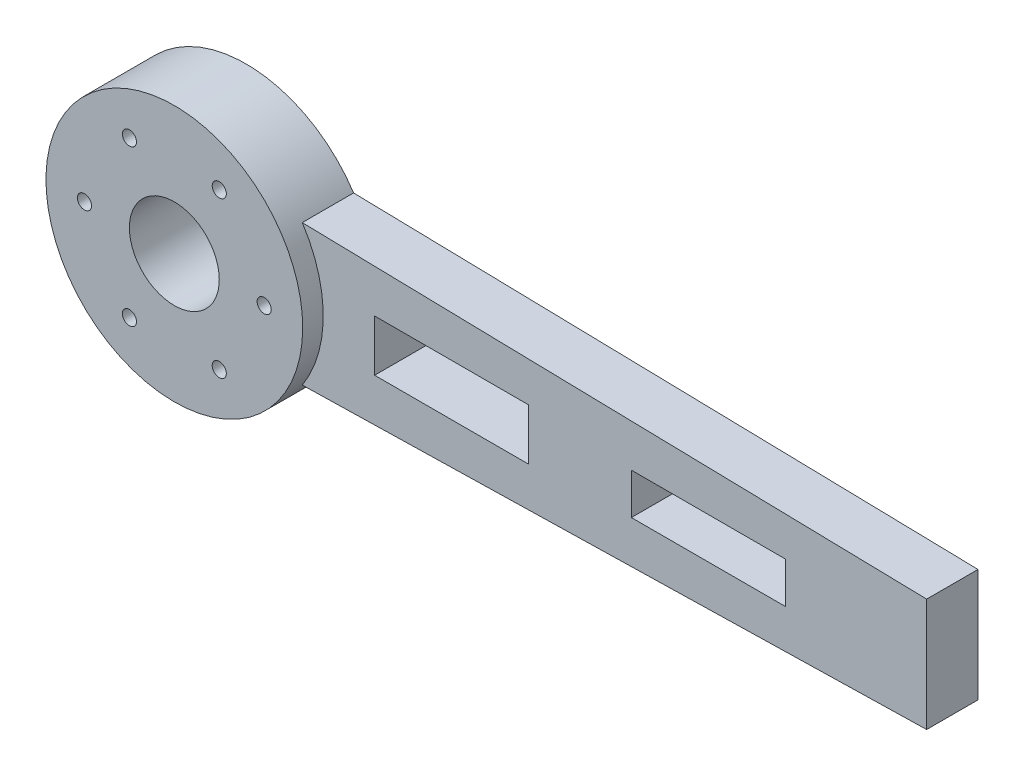
ISO-10303-21;
HEADER;
FILE_DESCRIPTION(('STEP AP214'),'2;1');
FILE_NAME('part.step','',(''),(''),'','','');
FILE_SCHEMA(('AUTOMOTIVE_DESIGN { 1 0 10303 214 1 1 1 1 }'));
ENDSEC;
DATA;
#1=APPLICATION_CONTEXT('core data for automotive mechanical design processes');
#2=APPLICATION_PROTOCOL_DEFINITION('international standard','automotive_design',2000,#1);
#3=PRODUCT_CONTEXT('',#1,'mechanical');
#4=PRODUCT('Part','Part','',(#3));
#5=PRODUCT_RELATED_PRODUCT_CATEGORY('part','',(#4));
#6=PRODUCT_DEFINITION_FORMATION('','',#4);
#7=PRODUCT_DEFINITION_CONTEXT('part definition',#1,'design');
#8=PRODUCT_DEFINITION('design','',#6,#7);
#9=PRODUCT_DEFINITION_SHAPE('','',#8);
#10=(LENGTH_UNIT() NAMED_UNIT(*) SI_UNIT(.MILLI.,.METRE.));
#11=(NAMED_UNIT(*) PLANE_ANGLE_UNIT() SI_UNIT($,.RADIAN.));
#12=(NAMED_UNIT(*) SI_UNIT($,.STERADIAN.) SOLID_ANGLE_UNIT());
#13=UNCERTAINTY_MEASURE_WITH_UNIT(LENGTH_MEASURE(1.E-05),#10,'distance_accuracy_value','');
#14=(GEOMETRIC_REPRESENTATION_CONTEXT(3) GLOBAL_UNCERTAINTY_ASSIGNED_CONTEXT((#13)) GLOBAL_UNIT_ASSIGNED_CONTEXT((#10,
#11,#12)) REPRESENTATION_CONTEXT('',''));
#15=CARTESIAN_POINT('',(0.,0.,0.));
#16=DIRECTION('',(0.,0.,1.));
#17=DIRECTION('',(1.,0.,0.));
#18=AXIS2_PLACEMENT_3D('',#15,#16,#17);
#19=CARTESIAN_POINT('',(0.,0.,28.));
#20=DIRECTION('',(0.,0.,-1.));
#21=DIRECTION('',(-1.,0.,0.));
#22=AXIS2_PLACEMENT_3D('',#19,#20,#21);
#23=CYLINDRICAL_SURFACE('',#22,50.);
#24=CARTESIAN_POINT('',(0.,0.,28.));
#25=DIRECTION('',(0.,0.,1.));
#26=DIRECTION('',(1.,0.,0.));
#27=AXIS2_PLACEMENT_3D('',#24,#25,#26);
#28=CIRCLE('',#27,50.);
#29=CARTESIAN_POINT('',(50.,0.,28.));
#30=VERTEX_POINT('',#29);
#31=EDGE_CURVE('E311',#30,#30,#28,.T.);
#32=ORIENTED_EDGE('',*,*,#31,.F.);
#33=EDGE_LOOP('',(#32));
#34=FACE_BOUND('',#33,.T.);
#35=DIRECTION('',(0.,0.,-1.));
#36=VECTOR('',#35,1.);
#37=CARTESIAN_POINT('',(41.8213149670181,-27.4039707785107,28.));
#38=LINE('',#37,#36);
#39=CARTESIAN_POINT('',(41.8213149670181,-27.4039707785107,20.));
#40=VERTEX_POINT('',#39);
#41=CARTESIAN_POINT('',(41.8213149670181,-27.4039707785107,0.));
#42=VERTEX_POINT('',#41);
#43=EDGE_CURVE('E47',#40,#42,#38,.T.);
#44=ORIENTED_EDGE('',*,*,#43,.F.);
#45=CARTESIAN_POINT('',(0.,0.,20.));
#46=DIRECTION('',(0.,0.,-1.));
#47=DIRECTION('',(-1.,0.,0.));
#48=AXIS2_PLACEMENT_3D('',#45,#46,#47);
#49=CIRCLE('',#48,50.);
#50=CARTESIAN_POINT('',(41.8213149670181,27.4039707785107,20.));
#51=VERTEX_POINT('',#50);
#52=EDGE_CURVE('E267',#51,#40,#49,.T.);
#53=ORIENTED_EDGE('',*,*,#52,.F.);
#54=DIRECTION('',(0.,0.,-1.));
#55=VECTOR('',#54,1.);
#56=CARTESIAN_POINT('',(41.8213149670181,27.4039707785107,28.));
#57=LINE('',#56,#55);
#58=CARTESIAN_POINT('',(41.8213149670181,27.4039707785107,0.));
#59=VERTEX_POINT('',#58);
#60=EDGE_CURVE('E269',#59,#51,#57,.F.);
#61=ORIENTED_EDGE('',*,*,#60,.F.);
#62=CARTESIAN_POINT('',(0.,0.,0.));
#63=DIRECTION('',(0.,0.,1.));
#64=DIRECTION('',(1.,0.,0.));
#65=AXIS2_PLACEMENT_3D('',#62,#63,#64);
#66=CIRCLE('',#65,50.);
#67=EDGE_CURVE('E52',#59,#42,#66,.T.);
#68=ORIENTED_EDGE('',*,*,#67,.T.);
#69=EDGE_LOOP('',(#44,#53,#61,#68));
#70=FACE_BOUND('',#69,.T.);
#71=ADVANCED_FACE('F33',(#34,#70),#23,.T.);
#72=CARTESIAN_POINT('',(0.,0.,28.));
#73=DIRECTION('',(0.,0.,-1.));
#74=DIRECTION('',(-1.,0.,0.));
#75=AXIS2_PLACEMENT_3D('',#72,#73,#74);
#76=CYLINDRICAL_SURFACE('',#75,17.5);
#77=CARTESIAN_POINT('',(0.,0.,28.));
#78=DIRECTION('',(0.,0.,1.));
#79=DIRECTION('',(1.,0.,0.));
#80=AXIS2_PLACEMENT_3D('',#77,#78,#79);
#81=CIRCLE('',#80,17.5);
#82=CARTESIAN_POINT('',(17.5,0.,28.));
#83=VERTEX_POINT('',#82);
#84=EDGE_CURVE('E306',#83,#83,#81,.T.);
#85=ORIENTED_EDGE('',*,*,#84,.T.);
#86=EDGE_LOOP('',(#85));
#87=FACE_BOUND('',#86,.T.);
#88=CARTESIAN_POINT('',(0.,0.,20.));
#89=DIRECTION('',(0.,0.,-1.));
#90=DIRECTION('',(-1.,0.,0.));
#91=AXIS2_PLACEMENT_3D('',#88,#89,#90);
#92=CIRCLE('',#91,17.5);
#93=CARTESIAN_POINT('',(15.,9.01387818865998,20.));
#94=VERTEX_POINT('',#93);
#95=CARTESIAN_POINT('',(15.,-9.01387818865998,20.));
#96=VERTEX_POINT('',#95);
#97=EDGE_CURVE('E264',#94,#96,#92,.T.);
#98=ORIENTED_EDGE('',*,*,#97,.T.);
#99=DIRECTION('',(0.,0.,-1.));
#100=VECTOR('',#99,1.);
#101=CARTESIAN_POINT('',(15.,-9.01387818865998,28.));
#102=LINE('',#101,#100);
#103=CARTESIAN_POINT('',(15.,-9.01387818865998,0.));
#104=VERTEX_POINT('',#103);
#105=EDGE_CURVE('E11',#96,#104,#102,.T.);
#106=ORIENTED_EDGE('',*,*,#105,.T.);
#107=CARTESIAN_POINT('',(0.,0.,0.));
#108=DIRECTION('',(0.,0.,1.));
#109=DIRECTION('',(1.,0.,0.));
#110=AXIS2_PLACEMENT_3D('',#107,#108,#109);
#111=CIRCLE('',#110,17.5);
#112=CARTESIAN_POINT('',(15.,9.01387818865998,0.));
#113=VERTEX_POINT('',#112);
#114=EDGE_CURVE('E305',#113,#104,#111,.T.);
#115=ORIENTED_EDGE('',*,*,#114,.F.);
#116=DIRECTION('',(0.,0.,-1.));
#117=VECTOR('',#116,1.);
#118=CARTESIAN_POINT('',(15.,9.01387818865998,28.));
#119=LINE('',#118,#117);
#120=EDGE_CURVE('E40',#113,#94,#119,.F.);
#121=ORIENTED_EDGE('',*,*,#120,.T.);
#122=EDGE_LOOP('',(#98,#106,#115,#121));
#123=FACE_BOUND('',#122,.T.);
#124=ADVANCED_FACE('F332',(#87,#123),#76,.F.);
#125=CARTESIAN_POINT('',(35.,0.,28.));
#126=DIRECTION('',(0.,0.,-1.));
#127=DIRECTION('',(-1.,0.,0.));
#128=AXIS2_PLACEMENT_3D('',#125,#126,#127);
#129=CYLINDRICAL_SURFACE('',#128,2.75);
#130=CARTESIAN_POINT('',(35.,0.,28.));
#131=DIRECTION('',(0.,0.,1.));
#132=DIRECTION('',(1.,0.,0.));
#133=AXIS2_PLACEMENT_3D('',#130,#131,#132);
#134=CIRCLE('',#133,2.75);
#135=CARTESIAN_POINT('',(37.75,0.,28.));
#136=VERTEX_POINT('',#135);
#137=EDGE_CURVE('E300',#136,#136,#134,.T.);
#138=ORIENTED_EDGE('',*,*,#137,.T.);
#139=EDGE_LOOP('',(#138));
#140=FACE_BOUND('',#139,.T.);
#141=CARTESIAN_POINT('',(35.,0.,20.));
#142=DIRECTION('',(0.,0.,-1.));
#143=DIRECTION('',(-1.,0.,0.));
#144=AXIS2_PLACEMENT_3D('',#141,#142,#143);
#145=CIRCLE('',#144,2.75);
#146=CARTESIAN_POINT('',(32.25,0.,20.));
#147=VERTEX_POINT('',#146);
#148=EDGE_CURVE('E261',#147,#147,#145,.T.);
#149=ORIENTED_EDGE('',*,*,#148,.T.);
#150=EDGE_LOOP('',(#149));
#151=FACE_BOUND('',#150,.T.);
#152=ADVANCED_FACE('F370',(#140,#151),#129,.F.);
#153=CARTESIAN_POINT('',(17.5,30.3108891324554,28.));
#154=DIRECTION('',(0.,0.,-1.));
#155=DIRECTION('',(-1.,0.,0.));
#156=AXIS2_PLACEMENT_3D('',#153,#154,#155);
#157=CYLINDRICAL_SURFACE('',#156,2.75);
#158=CARTESIAN_POINT('',(17.5,30.3108891324554,28.));
#159=DIRECTION('',(0.,0.,1.));
#160=DIRECTION('',(1.,0.,0.));
#161=AXIS2_PLACEMENT_3D('',#158,#159,#160);
#162=CIRCLE('',#161,2.75);
#163=CARTESIAN_POINT('',(20.25,30.3108891324554,28.));
#164=VERTEX_POINT('',#163);
#165=EDGE_CURVE('E297',#164,#164,#162,.T.);
#166=ORIENTED_EDGE('',*,*,#165,.T.);
#167=EDGE_LOOP('',(#166));
#168=FACE_BOUND('',#167,.T.);
#169=CARTESIAN_POINT('',(17.5,30.3108891324554,20.));
#170=DIRECTION('',(0.,0.,-1.));
#171=DIRECTION('',(-1.,0.,0.));
#172=AXIS2_PLACEMENT_3D('',#169,#170,#171);
#173=CIRCLE('',#172,2.75);
#174=CARTESIAN_POINT('',(18.8489494966299,27.9144677889638,20.));
#175=VERTEX_POINT('',#174);
#176=CARTESIAN_POINT('',(16.0459270966964,27.976757175629,20.));
#177=VERTEX_POINT('',#176);
#178=EDGE_CURVE('E258',#175,#177,#173,.T.);
#179=ORIENTED_EDGE('',*,*,#178,.T.);
#180=DIRECTION('',(0.,0.,-1.));
#181=VECTOR('',#180,1.);
#182=CARTESIAN_POINT('',(16.0459270966964,27.976757175629,28.));
#183=LINE('',#182,#181);
#184=CARTESIAN_POINT('',(16.0459270966964,27.976757175629,0.));
#185=VERTEX_POINT('',#184);
#186=EDGE_CURVE('E327',#177,#185,#183,.T.);
#187=ORIENTED_EDGE('',*,*,#186,.T.);
#188=CARTESIAN_POINT('',(17.5,30.3108891324554,0.));
#189=DIRECTION('',(0.,0.,1.));
#190=DIRECTION('',(1.,0.,0.));
#191=AXIS2_PLACEMENT_3D('',#188,#189,#190);
#192=CIRCLE('',#191,2.75);
#193=CARTESIAN_POINT('',(18.8489494966299,27.9144677889638,0.));
#194=VERTEX_POINT('',#193);
#195=EDGE_CURVE('E294',#194,#185,#192,.T.);
#196=ORIENTED_EDGE('',*,*,#195,.F.);
#197=DIRECTION('',(0.,0.,-1.));
#198=VECTOR('',#197,1.);
#199=CARTESIAN_POINT('',(18.8489494966299,27.9144677889638,28.));
#200=LINE('',#199,#198);
#201=EDGE_CURVE('E324',#194,#175,#200,.F.);
#202=ORIENTED_EDGE('',*,*,#201,.T.);
#203=EDGE_LOOP('',(#179,#187,#196,#202));
#204=FACE_BOUND('',#203,.T.);
#205=ADVANCED_FACE('F390',(#168,#204),#157,.F.);
#206=CARTESIAN_POINT('',(17.5,-30.3108891324554,28.));
#207=DIRECTION('',(0.,0.,-1.));
#208=DIRECTION('',(-1.,0.,0.));
#209=AXIS2_PLACEMENT_3D('',#206,#207,#208);
#210=CYLINDRICAL_SURFACE('',#209,2.74999999999997);
#211=CARTESIAN_POINT('',(17.5,-30.3108891324554,28.));
#212=DIRECTION('',(0.,0.,1.));
#213=DIRECTION('',(1.,0.,0.));
#214=AXIS2_PLACEMENT_3D('',#211,#212,#213);
#215=CIRCLE('',#214,2.74999999999997);
#216=CARTESIAN_POINT('',(20.25,-30.3108891324554,28.));
#217=VERTEX_POINT('',#216);
#218=EDGE_CURVE('E273',#217,#217,#215,.T.);
#219=ORIENTED_EDGE('',*,*,#218,.T.);
#220=EDGE_LOOP('',(#219));
#221=FACE_BOUND('',#220,.T.);
#222=CARTESIAN_POINT('',(17.5,-30.3108891324554,20.));
#223=DIRECTION('',(0.,0.,-1.));
#224=DIRECTION('',(-1.,0.,0.));
#225=AXIS2_PLACEMENT_3D('',#222,#223,#224);
#226=CIRCLE('',#225,2.74999999999997);
#227=CARTESIAN_POINT('',(16.0459270966964,-27.976757175629,20.));
#228=VERTEX_POINT('',#227);
#229=CARTESIAN_POINT('',(18.8489494966297,-27.9144677889638,20.));
#230=VERTEX_POINT('',#229);
#231=EDGE_CURVE('E318',#228,#230,#226,.T.);
#232=ORIENTED_EDGE('',*,*,#231,.T.);
#233=DIRECTION('',(0.,0.,-1.));
#234=VECTOR('',#233,1.);
#235=CARTESIAN_POINT('',(18.8489494966299,-27.9144677889638,28.));
#236=LINE('',#235,#234);
#237=CARTESIAN_POINT('',(18.8489494966297,-27.9144677889638,0.));
#238=VERTEX_POINT('',#237);
#239=EDGE_CURVE('E321',#230,#238,#236,.T.);
#240=ORIENTED_EDGE('',*,*,#239,.T.);
#241=CARTESIAN_POINT('',(17.5,-30.3108891324554,0.));
#242=DIRECTION('',(0.,0.,1.));
#243=DIRECTION('',(1.,0.,0.));
#244=AXIS2_PLACEMENT_3D('',#241,#242,#243);
#245=CIRCLE('',#244,2.74999999999997);
#246=CARTESIAN_POINT('',(16.0459270966963,-27.976757175629,0.));
#247=VERTEX_POINT('',#246);
#248=EDGE_CURVE('E272',#247,#238,#245,.T.);
#249=ORIENTED_EDGE('',*,*,#248,.F.);
#250=DIRECTION('',(0.,0.,-1.));
#251=VECTOR('',#250,1.);
#252=CARTESIAN_POINT('',(16.0459270966964,-27.976757175629,28.));
#253=LINE('',#252,#251);
#254=EDGE_CURVE('E314',#247,#228,#253,.F.);
#255=ORIENTED_EDGE('',*,*,#254,.T.);
#256=EDGE_LOOP('',(#232,#240,#249,#255));
#257=FACE_BOUND('',#256,.T.);
#258=ADVANCED_FACE('F377',(#221,#257),#210,.F.);
#259=CARTESIAN_POINT('',(0.,0.,28.));
#260=DIRECTION('',(0.,0.,1.));
#261=DIRECTION('',(1.,0.,0.));
#262=AXIS2_PLACEMENT_3D('',#259,#260,#261);
#263=PLANE('',#262);
#264=CARTESIAN_POINT('',(-17.5,-30.3108891324554,28.));
#265=DIRECTION('',(0.,0.,1.));
#266=DIRECTION('',(1.,0.,0.));
#267=AXIS2_PLACEMENT_3D('',#264,#265,#266);
#268=CIRCLE('',#267,2.74999999999998);
#269=CARTESIAN_POINT('',(-14.75,-30.3108891324554,28.));
#270=VERTEX_POINT('',#269);
#271=EDGE_CURVE('E279',#270,#270,#268,.T.);
#272=ORIENTED_EDGE('',*,*,#271,.F.);
#273=EDGE_LOOP('',(#272));
#274=FACE_BOUND('',#273,.T.);
#275=CARTESIAN_POINT('',(-17.5,30.3108891324554,28.));
#276=DIRECTION('',(0.,0.,1.));
#277=DIRECTION('',(1.,0.,0.));
#278=AXIS2_PLACEMENT_3D('',#275,#276,#277);
#279=CIRCLE('',#278,2.75);
#280=CARTESIAN_POINT('',(-14.75,30.3108891324554,28.));
#281=VERTEX_POINT('',#280);
#282=EDGE_CURVE('E291',#281,#281,#279,.T.);
#283=ORIENTED_EDGE('',*,*,#282,.F.);
#284=EDGE_LOOP('',(#283));
#285=FACE_BOUND('',#284,.T.);
#286=ORIENTED_EDGE('',*,*,#137,.F.);
#287=EDGE_LOOP('',(#286));
#288=FACE_BOUND('',#287,.T.);
#289=ORIENTED_EDGE('',*,*,#31,.T.);
#290=EDGE_LOOP('',(#289));
#291=FACE_BOUND('',#290,.T.);
#292=ORIENTED_EDGE('',*,*,#84,.F.);
#293=EDGE_LOOP('',(#292));
#294=FACE_BOUND('',#293,.T.);
#295=ORIENTED_EDGE('',*,*,#165,.F.);
#296=EDGE_LOOP('',(#295));
#297=FACE_BOUND('',#296,.T.);
#298=CARTESIAN_POINT('',(-35.,0.,28.));
#299=DIRECTION('',(0.,0.,1.));
#300=DIRECTION('',(1.,0.,0.));
#301=AXIS2_PLACEMENT_3D('',#298,#299,#300);
#302=CIRCLE('',#301,2.75);
#303=CARTESIAN_POINT('',(-32.25,0.,28.));
#304=VERTEX_POINT('',#303);
#305=EDGE_CURVE('E285',#304,#304,#302,.T.);
#306=ORIENTED_EDGE('',*,*,#305,.F.);
#307=EDGE_LOOP('',(#306));
#308=FACE_BOUND('',#307,.T.);
#309=ORIENTED_EDGE('',*,*,#218,.F.);
#310=EDGE_LOOP('',(#309));
#311=FACE_BOUND('',#310,.T.);
#312=ADVANCED_FACE('F342',(#274,#285,#288,#291,#294,#297,#308,#311),#263,.T.);
#313=CARTESIAN_POINT('',(0.,0.,0.));
#314=DIRECTION('',(0.,0.,1.));
#315=DIRECTION('',(1.,0.,0.));
#316=AXIS2_PLACEMENT_3D('',#313,#314,#315);
#317=PLANE('',#316);
#318=ORIENTED_EDGE('',*,*,#248,.T.);
#319=DIRECTION('',(0.99975317783161,0.0222167372851469,0.));
#320=VECTOR('',#319,1.);
#321=CARTESIAN_POINT('',(285.,-22.,0.));
#322=LINE('',#321,#320);
#323=EDGE_CURVE('E244',#247,#238,#322,.T.);
#324=ORIENTED_EDGE('',*,*,#323,.F.);
#325=EDGE_LOOP('',(#318,#324));
#326=FACE_BOUND('',#325,.T.);
#327=ORIENTED_EDGE('',*,*,#195,.T.);
#328=DIRECTION('',(-0.99975317783161,0.0222167372851469,0.));
#329=VECTOR('',#328,1.);
#330=CARTESIAN_POINT('',(15.,28.,0.));
#331=LINE('',#330,#329);
#332=EDGE_CURVE('E247',#194,#185,#331,.T.);
#333=ORIENTED_EDGE('',*,*,#332,.F.);
#334=EDGE_LOOP('',(#327,#333));
#335=FACE_BOUND('',#334,.T.);
#336=ORIENTED_EDGE('',*,*,#67,.F.);
#337=CARTESIAN_POINT('',(285.,22.,0.));
#338=VERTEX_POINT('',#337);
#339=EDGE_CURVE('E248',#338,#59,#331,.T.);
#340=ORIENTED_EDGE('',*,*,#339,.F.);
#341=DIRECTION('',(0.,1.,0.));
#342=VECTOR('',#341,1.);
#343=CARTESIAN_POINT('',(285.,22.,0.));
#344=LINE('',#343,#342);
#345=CARTESIAN_POINT('',(285.,-22.,0.));
#346=VERTEX_POINT('',#345);
#347=EDGE_CURVE('E245',#346,#338,#344,.T.);
#348=ORIENTED_EDGE('',*,*,#347,.F.);
#349=EDGE_CURVE('E228',#42,#346,#322,.T.);
#350=ORIENTED_EDGE('',*,*,#349,.F.);
#351=EDGE_LOOP('',(#336,#340,#348,#350));
#352=FACE_BOUND('',#351,.T.);
#353=ORIENTED_EDGE('',*,*,#114,.T.);
#354=DIRECTION('',(0.,-1.,0.));
#355=VECTOR('',#354,1.);
#356=CARTESIAN_POINT('',(15.,-28.,0.));
#357=LINE('',#356,#355);
#358=EDGE_CURVE('E232',#113,#104,#357,.T.);
#359=ORIENTED_EDGE('',*,*,#358,.F.);
#360=EDGE_LOOP('',(#353,#359));
#361=FACE_BOUND('',#360,.T.);
#362=DIRECTION('',(1.,0.,0.));
#363=VECTOR('',#362,1.);
#364=CARTESIAN_POINT('',(70.,-10.,0.));
#365=LINE('',#364,#363);
#366=CARTESIAN_POINT('',(70.,-10.,0.));
#367=VERTEX_POINT('',#366);
#368=CARTESIAN_POINT('',(130.,-10.,0.));
#369=VERTEX_POINT('',#368);
#370=EDGE_CURVE('E201',#367,#369,#365,.T.);
#371=ORIENTED_EDGE('',*,*,#370,.T.);
#372=DIRECTION('',(0.,1.,0.));
#373=VECTOR('',#372,1.);
#374=CARTESIAN_POINT('',(130.,-10.,0.));
#375=LINE('',#374,#373);
#376=CARTESIAN_POINT('',(130.,10.,0.));
#377=VERTEX_POINT('',#376);
#378=EDGE_CURVE('E174',#369,#377,#375,.T.);
#379=ORIENTED_EDGE('',*,*,#378,.T.);
#380=DIRECTION('',(-1.,0.,0.));
#381=VECTOR('',#380,1.);
#382=CARTESIAN_POINT('',(70.,10.,0.));
#383=LINE('',#382,#381);
#384=CARTESIAN_POINT('',(70.,10.,0.));
#385=VERTEX_POINT('',#384);
#386=EDGE_CURVE('E211',#377,#385,#383,.T.);
#387=ORIENTED_EDGE('',*,*,#386,.T.);
#388=DIRECTION('',(0.,-1.,0.));
#389=VECTOR('',#388,1.);
#390=CARTESIAN_POINT('',(70.,-10.,0.));
#391=LINE('',#390,#389);
#392=EDGE_CURVE('E214',#385,#367,#391,.T.);
#393=ORIENTED_EDGE('',*,*,#392,.T.);
#394=EDGE_LOOP('',(#371,#379,#387,#393));
#395=FACE_BOUND('',#394,.T.);
#396=DIRECTION('',(1.,0.,0.));
#397=VECTOR('',#396,1.);
#398=CARTESIAN_POINT('',(170.,-8.,0.));
#399=LINE('',#398,#397);
#400=CARTESIAN_POINT('',(170.,-8.,0.));
#401=VERTEX_POINT('',#400);
#402=CARTESIAN_POINT('',(230.,-8.,0.));
#403=VERTEX_POINT('',#402);
#404=EDGE_CURVE('E167',#401,#403,#399,.T.);
#405=ORIENTED_EDGE('',*,*,#404,.T.);
#406=DIRECTION('',(0.,1.,0.));
#407=VECTOR('',#406,1.);
#408=CARTESIAN_POINT('',(230.,-8.,0.));
#409=LINE('',#408,#407);
#410=CARTESIAN_POINT('',(230.,8.,0.));
#411=VERTEX_POINT('',#410);
#412=EDGE_CURVE('E186',#403,#411,#409,.T.);
#413=ORIENTED_EDGE('',*,*,#412,.T.);
#414=DIRECTION('',(-1.,0.,0.));
#415=VECTOR('',#414,1.);
#416=CARTESIAN_POINT('',(170.,8.,0.));
#417=LINE('',#416,#415);
#418=CARTESIAN_POINT('',(170.,8.,0.));
#419=VERTEX_POINT('',#418);
#420=EDGE_CURVE('E173',#411,#419,#417,.T.);
#421=ORIENTED_EDGE('',*,*,#420,.T.);
#422=DIRECTION('',(0.,-1.,0.));
#423=VECTOR('',#422,1.);
#424=CARTESIAN_POINT('',(170.,-8.,0.));
#425=LINE('',#424,#423);
#426=EDGE_CURVE('E189',#419,#401,#425,.T.);
#427=ORIENTED_EDGE('',*,*,#426,.T.);
#428=EDGE_LOOP('',(#405,#413,#421,#427));
#429=FACE_BOUND('',#428,.T.);
#430=CARTESIAN_POINT('',(-17.5,-30.3108891324554,0.));
#431=DIRECTION('',(0.,0.,1.));
#432=DIRECTION('',(1.,0.,0.));
#433=AXIS2_PLACEMENT_3D('',#430,#431,#432);
#434=CIRCLE('',#433,2.74999999999998);
#435=CARTESIAN_POINT('',(-14.75,-30.3108891324554,0.));
#436=VERTEX_POINT('',#435);
#437=EDGE_CURVE('E276',#436,#436,#434,.T.);
#438=ORIENTED_EDGE('',*,*,#437,.T.);
#439=EDGE_LOOP('',(#438));
#440=FACE_BOUND('',#439,.T.);
#441=CARTESIAN_POINT('',(-35.,0.,0.));
#442=DIRECTION('',(0.,0.,1.));
#443=DIRECTION('',(1.,0.,0.));
#444=AXIS2_PLACEMENT_3D('',#441,#442,#443);
#445=CIRCLE('',#444,2.75);
#446=CARTESIAN_POINT('',(-32.25,0.,0.));
#447=VERTEX_POINT('',#446);
#448=EDGE_CURVE('E282',#447,#447,#445,.T.);
#449=ORIENTED_EDGE('',*,*,#448,.T.);
#450=EDGE_LOOP('',(#449));
#451=FACE_BOUND('',#450,.T.);
#452=CARTESIAN_POINT('',(-17.5,30.3108891324554,0.));
#453=DIRECTION('',(0.,0.,1.));
#454=DIRECTION('',(1.,0.,0.));
#455=AXIS2_PLACEMENT_3D('',#452,#453,#454);
#456=CIRCLE('',#455,2.75);
#457=CARTESIAN_POINT('',(-14.75,30.3108891324554,0.));
#458=VERTEX_POINT('',#457);
#459=EDGE_CURVE('E288',#458,#458,#456,.T.);
#460=ORIENTED_EDGE('',*,*,#459,.T.);
#461=EDGE_LOOP('',(#460));
#462=FACE_BOUND('',#461,.T.);
#463=ADVANCED_FACE('F338',(#326,#335,#352,#361,#395,#429,#440,#451,#462),#317,.F.);
#464=CARTESIAN_POINT('',(-17.5,30.3108891324554,28.));
#465=DIRECTION('',(0.,0.,-1.));
#466=DIRECTION('',(-1.,0.,0.));
#467=AXIS2_PLACEMENT_3D('',#464,#465,#466);
#468=CYLINDRICAL_SURFACE('',#467,2.75);
#469=ORIENTED_EDGE('',*,*,#282,.T.);
#470=EDGE_LOOP('',(#469));
#471=FACE_BOUND('',#470,.T.);
#472=ORIENTED_EDGE('',*,*,#459,.F.);
#473=EDGE_LOOP('',(#472));
#474=FACE_BOUND('',#473,.T.);
#475=ADVANCED_FACE('F341',(#471,#474),#468,.F.);
#476=CARTESIAN_POINT('',(-35.,0.,28.));
#477=DIRECTION('',(0.,0.,-1.));
#478=DIRECTION('',(-1.,0.,0.));
#479=AXIS2_PLACEMENT_3D('',#476,#477,#478);
#480=CYLINDRICAL_SURFACE('',#479,2.75);
#481=ORIENTED_EDGE('',*,*,#305,.T.);
#482=EDGE_LOOP('',(#481));
#483=FACE_BOUND('',#482,.T.);
#484=ORIENTED_EDGE('',*,*,#448,.F.);
#485=EDGE_LOOP('',(#484));
#486=FACE_BOUND('',#485,.T.);
#487=ADVANCED_FACE('F355',(#483,#486),#480,.F.);
#488=CARTESIAN_POINT('',(-17.5,-30.3108891324554,28.));
#489=DIRECTION('',(0.,0.,-1.));
#490=DIRECTION('',(-1.,0.,0.));
#491=AXIS2_PLACEMENT_3D('',#488,#489,#490);
#492=CYLINDRICAL_SURFACE('',#491,2.74999999999998);
#493=ORIENTED_EDGE('',*,*,#271,.T.);
#494=EDGE_LOOP('',(#493));
#495=FACE_BOUND('',#494,.T.);
#496=ORIENTED_EDGE('',*,*,#437,.F.);
#497=EDGE_LOOP('',(#496));
#498=FACE_BOUND('',#497,.T.);
#499=ADVANCED_FACE('F361',(#495,#498),#492,.F.);
#500=CARTESIAN_POINT('',(285.,-22.,20.));
#501=DIRECTION('',(-0.0222167372851469,0.99975317783161,0.));
#502=DIRECTION('',(-0.99975317783161,-0.0222167372851469,0.));
#503=AXIS2_PLACEMENT_3D('',#500,#501,#502);
#504=PLANE('',#503);
#505=ORIENTED_EDGE('',*,*,#239,.F.);
#506=DIRECTION('',(0.99975317783161,0.0222167372851469,0.));
#507=VECTOR('',#506,1.);
#508=CARTESIAN_POINT('',(285.,-22.,20.));
#509=LINE('',#508,#507);
#510=EDGE_CURVE('E231',#228,#230,#509,.T.);
#511=ORIENTED_EDGE('',*,*,#510,.F.);
#512=ORIENTED_EDGE('',*,*,#254,.F.);
#513=ORIENTED_EDGE('',*,*,#323,.T.);
#514=EDGE_LOOP('',(#505,#511,#512,#513));
#515=FACE_BOUND('',#514,.T.);
#516=ADVANCED_FACE('F398',(#515),#504,.F.);
#517=CARTESIAN_POINT('',(0.,0.,20.));
#518=DIRECTION('',(0.,0.,-1.));
#519=DIRECTION('',(-1.,0.,0.));
#520=AXIS2_PLACEMENT_3D('',#517,#518,#519);
#521=PLANE('',#520);
#522=ORIENTED_EDGE('',*,*,#231,.F.);
#523=ORIENTED_EDGE('',*,*,#510,.T.);
#524=EDGE_LOOP('',(#522,#523));
#525=FACE_BOUND('',#524,.T.);
#526=ADVANCED_FACE('F396',(#525),#521,.F.);
#527=CARTESIAN_POINT('',(15.,28.,20.));
#528=DIRECTION('',(-0.0222167372851469,-0.99975317783161,0.));
#529=DIRECTION('',(0.99975317783161,-0.0222167372851469,0.));
#530=AXIS2_PLACEMENT_3D('',#527,#528,#529);
#531=PLANE('',#530);
#532=ORIENTED_EDGE('',*,*,#186,.F.);
#533=DIRECTION('',(-0.99975317783161,0.0222167372851469,0.));
#534=VECTOR('',#533,1.);
#535=CARTESIAN_POINT('',(15.,28.,20.));
#536=LINE('',#535,#534);
#537=EDGE_CURVE('E235',#175,#177,#536,.T.);
#538=ORIENTED_EDGE('',*,*,#537,.F.);
#539=ORIENTED_EDGE('',*,*,#201,.F.);
#540=ORIENTED_EDGE('',*,*,#332,.T.);
#541=EDGE_LOOP('',(#532,#538,#539,#540));
#542=FACE_BOUND('',#541,.T.);
#543=ADVANCED_FACE('F437',(#542),#531,.F.);
#544=ORIENTED_EDGE('',*,*,#178,.F.);
#545=ORIENTED_EDGE('',*,*,#537,.T.);
#546=EDGE_LOOP('',(#544,#545));
#547=FACE_BOUND('',#546,.T.);
#548=ADVANCED_FACE('F438',(#547),#521,.F.);
#549=ORIENTED_EDGE('',*,*,#148,.F.);
#550=EDGE_LOOP('',(#549));
#551=FACE_BOUND('',#550,.T.);
#552=ADVANCED_FACE('F435',(#551),#521,.F.);
#553=CARTESIAN_POINT('',(15.,-28.,20.));
#554=DIRECTION('',(1.,0.,0.));
#555=DIRECTION('',(0.,0.,-1.));
#556=AXIS2_PLACEMENT_3D('',#553,#554,#555);
#557=PLANE('',#556);
#558=ORIENTED_EDGE('',*,*,#105,.F.);
#559=DIRECTION('',(0.,-1.,0.));
#560=VECTOR('',#559,1.);
#561=CARTESIAN_POINT('',(15.,-28.,20.));
#562=LINE('',#561,#560);
#563=EDGE_CURVE('E239',#94,#96,#562,.T.);
#564=ORIENTED_EDGE('',*,*,#563,.F.);
#565=ORIENTED_EDGE('',*,*,#120,.F.);
#566=ORIENTED_EDGE('',*,*,#358,.T.);
#567=EDGE_LOOP('',(#558,#564,#565,#566));
#568=FACE_BOUND('',#567,.T.);
#569=ADVANCED_FACE('F336',(#568),#557,.F.);
#570=ORIENTED_EDGE('',*,*,#97,.F.);
#571=ORIENTED_EDGE('',*,*,#563,.T.);
#572=EDGE_LOOP('',(#570,#571));
#573=FACE_BOUND('',#572,.T.);
#574=ADVANCED_FACE('F422',(#573),#521,.F.);
#575=ORIENTED_EDGE('',*,*,#339,.T.);
#576=ORIENTED_EDGE('',*,*,#60,.T.);
#577=CARTESIAN_POINT('',(285.,22.,20.));
#578=VERTEX_POINT('',#577);
#579=EDGE_CURVE('E236',#578,#51,#536,.T.);
#580=ORIENTED_EDGE('',*,*,#579,.F.);
#581=DIRECTION('',(0.,0.,-1.));
#582=VECTOR('',#581,1.);
#583=CARTESIAN_POINT('',(285.,22.,20.));
#584=LINE('',#583,#582);
#585=EDGE_CURVE('E242',#578,#338,#584,.T.);
#586=ORIENTED_EDGE('',*,*,#585,.T.);
#587=EDGE_LOOP('',(#575,#576,#580,#586));
#588=FACE_BOUND('',#587,.T.);
#589=ADVANCED_FACE('F408',(#588),#531,.F.);
#590=CARTESIAN_POINT('',(285.,-22.,20.));
#591=VERTEX_POINT('',#590);
#592=EDGE_CURVE('E229',#40,#591,#509,.T.);
#593=ORIENTED_EDGE('',*,*,#592,.F.);
#594=ORIENTED_EDGE('',*,*,#43,.T.);
#595=ORIENTED_EDGE('',*,*,#349,.T.);
#596=DIRECTION('',(0.,0.,-1.));
#597=VECTOR('',#596,1.);
#598=CARTESIAN_POINT('',(285.,-22.,20.));
#599=LINE('',#598,#597);
#600=EDGE_CURVE('E254',#591,#346,#599,.T.);
#601=ORIENTED_EDGE('',*,*,#600,.F.);
#602=EDGE_LOOP('',(#593,#594,#595,#601));
#603=FACE_BOUND('',#602,.T.);
#604=ADVANCED_FACE('F417',(#603),#504,.F.);
#605=DIRECTION('',(0.,1.,0.));
#606=VECTOR('',#605,1.);
#607=CARTESIAN_POINT('',(130.,-10.,20.));
#608=LINE('',#607,#606);
#609=CARTESIAN_POINT('',(130.,-10.,20.));
#610=VERTEX_POINT('',#609);
#611=CARTESIAN_POINT('',(130.,10.,20.));
#612=VERTEX_POINT('',#611);
#613=EDGE_CURVE('E198',#610,#612,#608,.T.);
#614=ORIENTED_EDGE('',*,*,#613,.F.);
#615=DIRECTION('',(1.,0.,0.));
#616=VECTOR('',#615,1.);
#617=CARTESIAN_POINT('',(70.,-10.,20.));
#618=LINE('',#617,#616);
#619=CARTESIAN_POINT('',(70.,-10.,20.));
#620=VERTEX_POINT('',#619);
#621=EDGE_CURVE('E206',#620,#610,#618,.T.);
#622=ORIENTED_EDGE('',*,*,#621,.F.);
#623=DIRECTION('',(0.,-1.,0.));
#624=VECTOR('',#623,1.);
#625=CARTESIAN_POINT('',(70.,-10.,20.));
#626=LINE('',#625,#624);
#627=CARTESIAN_POINT('',(70.,10.,20.));
#628=VERTEX_POINT('',#627);
#629=EDGE_CURVE('E203',#628,#620,#626,.T.);
#630=ORIENTED_EDGE('',*,*,#629,.F.);
#631=DIRECTION('',(-1.,0.,0.));
#632=VECTOR('',#631,1.);
#633=CARTESIAN_POINT('',(70.,10.,20.));
#634=LINE('',#633,#632);
#635=EDGE_CURVE('E200',#612,#628,#634,.T.);
#636=ORIENTED_EDGE('',*,*,#635,.F.);
#637=EDGE_LOOP('',(#614,#622,#630,#636));
#638=FACE_BOUND('',#637,.T.);
#639=ORIENTED_EDGE('',*,*,#579,.T.);
#640=ORIENTED_EDGE('',*,*,#52,.T.);
#641=ORIENTED_EDGE('',*,*,#592,.T.);
#642=DIRECTION('',(0.,1.,0.));
#643=VECTOR('',#642,1.);
#644=CARTESIAN_POINT('',(285.,22.,20.));
#645=LINE('',#644,#643);
#646=EDGE_CURVE('E233',#591,#578,#645,.T.);
#647=ORIENTED_EDGE('',*,*,#646,.T.);
#648=EDGE_LOOP('',(#639,#640,#641,#647));
#649=FACE_BOUND('',#648,.T.);
#650=DIRECTION('',(0.,1.,0.));
#651=VECTOR('',#650,1.);
#652=CARTESIAN_POINT('',(230.,-8.,20.));
#653=LINE('',#652,#651);
#654=CARTESIAN_POINT('',(230.,-8.,20.));
#655=VERTEX_POINT('',#654);
#656=CARTESIAN_POINT('',(230.,8.,20.));
#657=VERTEX_POINT('',#656);
#658=EDGE_CURVE('E156',#655,#657,#653,.T.);
#659=ORIENTED_EDGE('',*,*,#658,.F.);
#660=DIRECTION('',(1.,0.,0.));
#661=VECTOR('',#660,1.);
#662=CARTESIAN_POINT('',(170.,-8.,20.));
#663=LINE('',#662,#661);
#664=CARTESIAN_POINT('',(170.,-8.,20.));
#665=VERTEX_POINT('',#664);
#666=EDGE_CURVE('E182',#665,#655,#663,.T.);
#667=ORIENTED_EDGE('',*,*,#666,.F.);
#668=DIRECTION('',(0.,-1.,0.));
#669=VECTOR('',#668,1.);
#670=CARTESIAN_POINT('',(170.,-8.,20.));
#671=LINE('',#670,#669);
#672=CARTESIAN_POINT('',(170.,8.,20.));
#673=VERTEX_POINT('',#672);
#674=EDGE_CURVE('E180',#673,#665,#671,.T.);
#675=ORIENTED_EDGE('',*,*,#674,.F.);
#676=DIRECTION('',(-1.,0.,0.));
#677=VECTOR('',#676,1.);
#678=CARTESIAN_POINT('',(170.,8.,20.));
#679=LINE('',#678,#677);
#680=EDGE_CURVE('E166',#657,#673,#679,.T.);
#681=ORIENTED_EDGE('',*,*,#680,.F.);
#682=EDGE_LOOP('',(#659,#667,#675,#681));
#683=FACE_BOUND('',#682,.T.);
#684=ADVANCED_FACE('F178',(#638,#649,#683),#521,.F.);
#685=CARTESIAN_POINT('',(285.,22.,20.));
#686=DIRECTION('',(-1.,0.,0.));
#687=DIRECTION('',(0.,0.,1.));
#688=AXIS2_PLACEMENT_3D('',#685,#686,#687);
#689=PLANE('',#688);
#690=ORIENTED_EDGE('',*,*,#347,.T.);
#691=ORIENTED_EDGE('',*,*,#585,.F.);
#692=ORIENTED_EDGE('',*,*,#646,.F.);
#693=ORIENTED_EDGE('',*,*,#600,.T.);
#694=EDGE_LOOP('',(#690,#691,#692,#693));
#695=FACE_BOUND('',#694,.T.);
#696=ADVANCED_FACE('F413',(#695),#689,.F.);
#697=CARTESIAN_POINT('',(130.,-10.,20.));
#698=DIRECTION('',(-1.,0.,0.));
#699=DIRECTION('',(0.,0.,1.));
#700=AXIS2_PLACEMENT_3D('',#697,#698,#699);
#701=PLANE('',#700);
#702=ORIENTED_EDGE('',*,*,#378,.F.);
#703=DIRECTION('',(0.,0.,-1.));
#704=VECTOR('',#703,1.);
#705=CARTESIAN_POINT('',(130.,-10.,20.));
#706=LINE('',#705,#704);
#707=EDGE_CURVE('E208',#610,#369,#706,.T.);
#708=ORIENTED_EDGE('',*,*,#707,.F.);
#709=ORIENTED_EDGE('',*,*,#613,.T.);
#710=DIRECTION('',(0.,0.,-1.));
#711=VECTOR('',#710,1.);
#712=CARTESIAN_POINT('',(130.,10.,20.));
#713=LINE('',#712,#711);
#714=EDGE_CURVE('E225',#612,#377,#713,.T.);
#715=ORIENTED_EDGE('',*,*,#714,.T.);
#716=EDGE_LOOP('',(#702,#708,#709,#715));
#717=FACE_BOUND('',#716,.T.);
#718=ADVANCED_FACE('F427',(#717),#701,.T.);
#719=CARTESIAN_POINT('',(70.,10.,20.));
#720=DIRECTION('',(0.,-1.,0.));
#721=DIRECTION('',(0.,0.,-1.));
#722=AXIS2_PLACEMENT_3D('',#719,#720,#721);
#723=PLANE('',#722);
#724=ORIENTED_EDGE('',*,*,#386,.F.);
#725=ORIENTED_EDGE('',*,*,#714,.F.);
#726=ORIENTED_EDGE('',*,*,#635,.T.);
#727=DIRECTION('',(0.,0.,-1.));
#728=VECTOR('',#727,1.);
#729=CARTESIAN_POINT('',(70.,10.,20.));
#730=LINE('',#729,#728);
#731=EDGE_CURVE('E223',#628,#385,#730,.T.);
#732=ORIENTED_EDGE('',*,*,#731,.T.);
#733=EDGE_LOOP('',(#724,#725,#726,#732));
#734=FACE_BOUND('',#733,.T.);
#735=ADVANCED_FACE('F582',(#734),#723,.T.);
#736=CARTESIAN_POINT('',(70.,-10.,20.));
#737=DIRECTION('',(1.,0.,0.));
#738=DIRECTION('',(0.,0.,-1.));
#739=AXIS2_PLACEMENT_3D('',#736,#737,#738);
#740=PLANE('',#739);
#741=ORIENTED_EDGE('',*,*,#392,.F.);
#742=ORIENTED_EDGE('',*,*,#731,.F.);
#743=ORIENTED_EDGE('',*,*,#629,.T.);
#744=DIRECTION('',(0.,0.,-1.));
#745=VECTOR('',#744,1.);
#746=CARTESIAN_POINT('',(70.,-10.,20.));
#747=LINE('',#746,#745);
#748=EDGE_CURVE('E221',#620,#367,#747,.T.);
#749=ORIENTED_EDGE('',*,*,#748,.T.);
#750=EDGE_LOOP('',(#741,#742,#743,#749));
#751=FACE_BOUND('',#750,.T.);
#752=ADVANCED_FACE('F591',(#751),#740,.T.);
#753=CARTESIAN_POINT('',(70.,-10.,20.));
#754=DIRECTION('',(0.,1.,0.));
#755=DIRECTION('',(0.,0.,1.));
#756=AXIS2_PLACEMENT_3D('',#753,#754,#755);
#757=PLANE('',#756);
#758=ORIENTED_EDGE('',*,*,#370,.F.);
#759=ORIENTED_EDGE('',*,*,#748,.F.);
#760=ORIENTED_EDGE('',*,*,#621,.T.);
#761=ORIENTED_EDGE('',*,*,#707,.T.);
#762=EDGE_LOOP('',(#758,#759,#760,#761));
#763=FACE_BOUND('',#762,.T.);
#764=ADVANCED_FACE('F601',(#763),#757,.T.);
#765=CARTESIAN_POINT('',(230.,-8.,20.));
#766=DIRECTION('',(-1.,0.,0.));
#767=DIRECTION('',(0.,0.,1.));
#768=AXIS2_PLACEMENT_3D('',#765,#766,#767);
#769=PLANE('',#768);
#770=ORIENTED_EDGE('',*,*,#412,.F.);
#771=DIRECTION('',(0.,0.,-1.));
#772=VECTOR('',#771,1.);
#773=CARTESIAN_POINT('',(230.,-8.,20.));
#774=LINE('',#773,#772);
#775=EDGE_CURVE('E162',#655,#403,#774,.T.);
#776=ORIENTED_EDGE('',*,*,#775,.F.);
#777=ORIENTED_EDGE('',*,*,#658,.T.);
#778=DIRECTION('',(0.,0.,-1.));
#779=VECTOR('',#778,1.);
#780=CARTESIAN_POINT('',(230.,8.,20.));
#781=LINE('',#780,#779);
#782=EDGE_CURVE('E159',#657,#411,#781,.T.);
#783=ORIENTED_EDGE('',*,*,#782,.T.);
#784=EDGE_LOOP('',(#770,#776,#777,#783));
#785=FACE_BOUND('',#784,.T.);
#786=ADVANCED_FACE('F158',(#785),#769,.T.);
#787=CARTESIAN_POINT('',(170.,8.,20.));
#788=DIRECTION('',(0.,-1.,0.));
#789=DIRECTION('',(0.,0.,-1.));
#790=AXIS2_PLACEMENT_3D('',#787,#788,#789);
#791=PLANE('',#790);
#792=ORIENTED_EDGE('',*,*,#420,.F.);
#793=ORIENTED_EDGE('',*,*,#782,.F.);
#794=ORIENTED_EDGE('',*,*,#680,.T.);
#795=DIRECTION('',(0.,0.,-1.));
#796=VECTOR('',#795,1.);
#797=CARTESIAN_POINT('',(170.,8.,20.));
#798=LINE('',#797,#796);
#799=EDGE_CURVE('E175',#673,#419,#798,.T.);
#800=ORIENTED_EDGE('',*,*,#799,.T.);
#801=EDGE_LOOP('',(#792,#793,#794,#800));
#802=FACE_BOUND('',#801,.T.);
#803=ADVANCED_FACE('F170',(#802),#791,.T.);
#804=CARTESIAN_POINT('',(170.,-8.,20.));
#805=DIRECTION('',(1.,0.,0.));
#806=DIRECTION('',(0.,0.,-1.));
#807=AXIS2_PLACEMENT_3D('',#804,#805,#806);
#808=PLANE('',#807);
#809=ORIENTED_EDGE('',*,*,#426,.F.);
#810=ORIENTED_EDGE('',*,*,#799,.F.);
#811=ORIENTED_EDGE('',*,*,#674,.T.);
#812=DIRECTION('',(0.,0.,-1.));
#813=VECTOR('',#812,1.);
#814=CARTESIAN_POINT('',(170.,-8.,20.));
#815=LINE('',#814,#813);
#816=EDGE_CURVE('E195',#665,#401,#815,.T.);
#817=ORIENTED_EDGE('',*,*,#816,.T.);
#818=EDGE_LOOP('',(#809,#810,#811,#817));
#819=FACE_BOUND('',#818,.T.);
#820=ADVANCED_FACE('F628',(#819),#808,.T.);
#821=CARTESIAN_POINT('',(170.,-8.,20.));
#822=DIRECTION('',(0.,1.,0.));
#823=DIRECTION('',(0.,0.,1.));
#824=AXIS2_PLACEMENT_3D('',#821,#822,#823);
#825=PLANE('',#824);
#826=ORIENTED_EDGE('',*,*,#404,.F.);
#827=ORIENTED_EDGE('',*,*,#816,.F.);
#828=ORIENTED_EDGE('',*,*,#666,.T.);
#829=ORIENTED_EDGE('',*,*,#775,.T.);
#830=EDGE_LOOP('',(#826,#827,#828,#829));
#831=FACE_BOUND('',#830,.T.);
#832=ADVANCED_FACE('F637',(#831),#825,.T.);
#833=CLOSED_SHELL('',(#71,#124,#152,#205,#258,#312,#463,#475,#487,#499,#516,#526,#543,#548,#552,
#569,#574,#589,#604,#684,#696,#718,#735,#752,#764,#786,#803,#820,#832));
#834=MANIFOLD_SOLID_BREP('B2',#833);
#835=ADVANCED_BREP_SHAPE_REPRESENTATION('',(#18,#834),#14);
#836=SHAPE_DEFINITION_REPRESENTATION(#9,#835);
ENDSEC;
END-ISO-10303-21;
